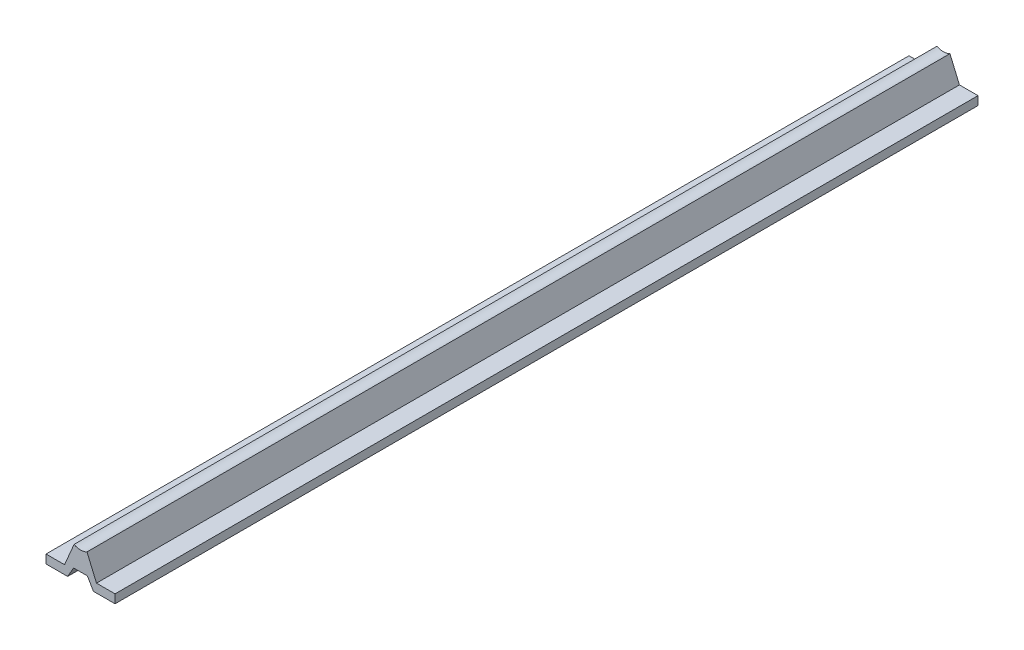
ISO-10303-21;
HEADER;
FILE_DESCRIPTION(('STEP AP214'),'2;1');
FILE_NAME('part.step','',(''),(''),'','','');
FILE_SCHEMA(('AUTOMOTIVE_DESIGN { 1 0 10303 214 1 1 1 1 }'));
ENDSEC;
DATA;
#1=APPLICATION_CONTEXT('core data for automotive mechanical design processes');
#2=APPLICATION_PROTOCOL_DEFINITION('international standard','automotive_design',2000,#1);
#3=PRODUCT_CONTEXT('',#1,'mechanical');
#4=PRODUCT('Part','Part','',(#3));
#5=PRODUCT_RELATED_PRODUCT_CATEGORY('part','',(#4));
#6=PRODUCT_DEFINITION_FORMATION('','',#4);
#7=PRODUCT_DEFINITION_CONTEXT('part definition',#1,'design');
#8=PRODUCT_DEFINITION('design','',#6,#7);
#9=PRODUCT_DEFINITION_SHAPE('','',#8);
#10=(LENGTH_UNIT() NAMED_UNIT(*) SI_UNIT(.MILLI.,.METRE.));
#11=(NAMED_UNIT(*) PLANE_ANGLE_UNIT() SI_UNIT($,.RADIAN.));
#12=(NAMED_UNIT(*) SI_UNIT($,.STERADIAN.) SOLID_ANGLE_UNIT());
#13=UNCERTAINTY_MEASURE_WITH_UNIT(LENGTH_MEASURE(1.E-05),#10,'distance_accuracy_value','');
#14=(GEOMETRIC_REPRESENTATION_CONTEXT(3) GLOBAL_UNCERTAINTY_ASSIGNED_CONTEXT((#13)) GLOBAL_UNIT_ASSIGNED_CONTEXT((#10,
#11,#12)) REPRESENTATION_CONTEXT('',''));
#15=CARTESIAN_POINT('',(0.,0.,0.));
#16=DIRECTION('',(0.,0.,1.));
#17=DIRECTION('',(1.,0.,0.));
#18=AXIS2_PLACEMENT_3D('',#15,#16,#17);
#19=CARTESIAN_POINT('',(-20.,-25.,500.));
#20=DIRECTION('',(1.,0.,0.));
#21=DIRECTION('',(0.,0.,-1.));
#22=AXIS2_PLACEMENT_3D('',#19,#20,#21);
#23=PLANE('',#22);
#24=DIRECTION('',(0.,-1.,0.));
#25=VECTOR('',#24,1.);
#26=CARTESIAN_POINT('',(-20.,-25.,0.));
#27=LINE('',#26,#25);
#28=CARTESIAN_POINT('',(-20.,-20.,0.));
#29=VERTEX_POINT('',#28);
#30=CARTESIAN_POINT('',(-20.,-25.,0.));
#31=VERTEX_POINT('',#30);
#32=EDGE_CURVE('E153',#29,#31,#27,.T.);
#33=ORIENTED_EDGE('',*,*,#32,.T.);
#34=DIRECTION('',(0.,0.,-1.));
#35=VECTOR('',#34,1.);
#36=CARTESIAN_POINT('',(-20.,-25.,500.));
#37=LINE('',#36,#35);
#38=CARTESIAN_POINT('',(-20.,-25.,500.));
#39=VERTEX_POINT('',#38);
#40=EDGE_CURVE('E11',#39,#31,#37,.T.);
#41=ORIENTED_EDGE('',*,*,#40,.F.);
#42=DIRECTION('',(0.,-1.,0.));
#43=VECTOR('',#42,1.);
#44=CARTESIAN_POINT('',(-20.,-25.,500.));
#45=LINE('',#44,#43);
#46=CARTESIAN_POINT('',(-20.,-20.,500.));
#47=VERTEX_POINT('',#46);
#48=EDGE_CURVE('E175',#47,#39,#45,.T.);
#49=ORIENTED_EDGE('',*,*,#48,.F.);
#50=DIRECTION('',(0.,0.,-1.));
#51=VECTOR('',#50,1.);
#52=CARTESIAN_POINT('',(-20.,-20.,500.));
#53=LINE('',#52,#51);
#54=EDGE_CURVE('E149',#47,#29,#53,.T.);
#55=ORIENTED_EDGE('',*,*,#54,.T.);
#56=EDGE_LOOP('',(#33,#41,#49,#55));
#57=FACE_BOUND('',#56,.T.);
#58=ADVANCED_FACE('F33',(#57),#23,.F.);
#59=CARTESIAN_POINT('',(-20.,-25.,500.));
#60=DIRECTION('',(0.,1.,0.));
#61=DIRECTION('',(0.,0.,1.));
#62=AXIS2_PLACEMENT_3D('',#59,#60,#61);
#63=PLANE('',#62);
#64=DIRECTION('',(1.,0.,0.));
#65=VECTOR('',#64,1.);
#66=CARTESIAN_POINT('',(-20.,-25.,0.));
#67=LINE('',#66,#65);
#68=CARTESIAN_POINT('',(-7.46410161513775,-25.,0.));
#69=VERTEX_POINT('',#68);
#70=EDGE_CURVE('E156',#31,#69,#67,.T.);
#71=ORIENTED_EDGE('',*,*,#70,.T.);
#72=DIRECTION('',(0.,0.,-1.));
#73=VECTOR('',#72,1.);
#74=CARTESIAN_POINT('',(-7.46410161513775,-25.,500.));
#75=LINE('',#74,#73);
#76=CARTESIAN_POINT('',(-7.46410161513775,-25.,500.));
#77=VERTEX_POINT('',#76);
#78=EDGE_CURVE('E41',#77,#69,#75,.T.);
#79=ORIENTED_EDGE('',*,*,#78,.F.);
#80=DIRECTION('',(1.,0.,0.));
#81=VECTOR('',#80,1.);
#82=CARTESIAN_POINT('',(-20.,-25.,500.));
#83=LINE('',#82,#81);
#84=EDGE_CURVE('E104',#39,#77,#83,.T.);
#85=ORIENTED_EDGE('',*,*,#84,.F.);
#86=ORIENTED_EDGE('',*,*,#40,.T.);
#87=EDGE_LOOP('',(#71,#79,#85,#86));
#88=FACE_BOUND('',#87,.T.);
#89=ADVANCED_FACE('F253',(#88),#63,.F.);
#90=CARTESIAN_POINT('',(-7.46410161513775,-25.,500.));
#91=DIRECTION('',(-0.866025403784439,0.5,0.));
#92=DIRECTION('',(-0.5,-0.866025403784439,0.));
#93=AXIS2_PLACEMENT_3D('',#90,#91,#92);
#94=PLANE('',#93);
#95=DIRECTION('',(0.5,0.866025403784439,0.));
#96=VECTOR('',#95,1.);
#97=CARTESIAN_POINT('',(-7.46410161513775,-25.,0.));
#98=LINE('',#97,#96);
#99=CARTESIAN_POINT('',(-4.,-19.,0.));
#100=VERTEX_POINT('',#99);
#101=EDGE_CURVE('E158',#69,#100,#98,.T.);
#102=ORIENTED_EDGE('',*,*,#101,.T.);
#103=DIRECTION('',(0.,0.,-1.));
#104=VECTOR('',#103,1.);
#105=CARTESIAN_POINT('',(-4.,-19.,500.));
#106=LINE('',#105,#104);
#107=CARTESIAN_POINT('',(-4.,-19.,500.));
#108=VERTEX_POINT('',#107);
#109=EDGE_CURVE('E194',#108,#100,#106,.T.);
#110=ORIENTED_EDGE('',*,*,#109,.F.);
#111=DIRECTION('',(0.5,0.866025403784439,0.));
#112=VECTOR('',#111,1.);
#113=CARTESIAN_POINT('',(-7.46410161513775,-25.,500.));
#114=LINE('',#113,#112);
#115=EDGE_CURVE('E202',#77,#108,#114,.T.);
#116=ORIENTED_EDGE('',*,*,#115,.F.);
#117=ORIENTED_EDGE('',*,*,#78,.T.);
#118=EDGE_LOOP('',(#102,#110,#116,#117));
#119=FACE_BOUND('',#118,.T.);
#120=ADVANCED_FACE('F200',(#119),#94,.F.);
#121=CARTESIAN_POINT('',(-4.,-19.,500.));
#122=DIRECTION('',(0.,1.,0.));
#123=DIRECTION('',(0.,0.,1.));
#124=AXIS2_PLACEMENT_3D('',#121,#122,#123);
#125=PLANE('',#124);
#126=DIRECTION('',(1.,0.,0.));
#127=VECTOR('',#126,1.);
#128=CARTESIAN_POINT('',(-4.,-19.,0.));
#129=LINE('',#128,#127);
#130=CARTESIAN_POINT('',(4.,-19.,0.));
#131=VERTEX_POINT('',#130);
#132=EDGE_CURVE('E160',#100,#131,#129,.T.);
#133=ORIENTED_EDGE('',*,*,#132,.T.);
#134=DIRECTION('',(0.,0.,-1.));
#135=VECTOR('',#134,1.);
#136=CARTESIAN_POINT('',(4.,-19.,500.));
#137=LINE('',#136,#135);
#138=CARTESIAN_POINT('',(4.,-19.,500.));
#139=VERTEX_POINT('',#138);
#140=EDGE_CURVE('E191',#139,#131,#137,.T.);
#141=ORIENTED_EDGE('',*,*,#140,.F.);
#142=DIRECTION('',(1.,0.,0.));
#143=VECTOR('',#142,1.);
#144=CARTESIAN_POINT('',(-4.,-19.,500.));
#145=LINE('',#144,#143);
#146=EDGE_CURVE('E220',#108,#139,#145,.T.);
#147=ORIENTED_EDGE('',*,*,#146,.F.);
#148=ORIENTED_EDGE('',*,*,#109,.T.);
#149=EDGE_LOOP('',(#133,#141,#147,#148));
#150=FACE_BOUND('',#149,.T.);
#151=ADVANCED_FACE('F211',(#150),#125,.F.);
#152=CARTESIAN_POINT('',(4.,-19.,500.));
#153=DIRECTION('',(0.866025403784439,0.499999999999999,0.));
#154=DIRECTION('',(-0.499999999999999,0.866025403784439,0.));
#155=AXIS2_PLACEMENT_3D('',#152,#153,#154);
#156=PLANE('',#155);
#157=DIRECTION('',(0.499999999999999,-0.866025403784439,0.));
#158=VECTOR('',#157,1.);
#159=CARTESIAN_POINT('',(4.,-19.,0.));
#160=LINE('',#159,#158);
#161=CARTESIAN_POINT('',(7.46410161513775,-25.,0.));
#162=VERTEX_POINT('',#161);
#163=EDGE_CURVE('E162',#131,#162,#160,.T.);
#164=ORIENTED_EDGE('',*,*,#163,.T.);
#165=DIRECTION('',(0.,0.,-1.));
#166=VECTOR('',#165,1.);
#167=CARTESIAN_POINT('',(7.46410161513775,-25.,500.));
#168=LINE('',#167,#166);
#169=CARTESIAN_POINT('',(7.46410161513775,-25.,500.));
#170=VERTEX_POINT('',#169);
#171=EDGE_CURVE('E188',#170,#162,#168,.T.);
#172=ORIENTED_EDGE('',*,*,#171,.F.);
#173=DIRECTION('',(0.499999999999999,-0.866025403784439,0.));
#174=VECTOR('',#173,1.);
#175=CARTESIAN_POINT('',(4.,-19.,500.));
#176=LINE('',#175,#174);
#177=EDGE_CURVE('E217',#139,#170,#176,.T.);
#178=ORIENTED_EDGE('',*,*,#177,.F.);
#179=ORIENTED_EDGE('',*,*,#140,.T.);
#180=EDGE_LOOP('',(#164,#172,#178,#179));
#181=FACE_BOUND('',#180,.T.);
#182=ADVANCED_FACE('F215',(#181),#156,.F.);
#183=CARTESIAN_POINT('',(7.46410161513775,-25.,500.));
#184=DIRECTION('',(0.,1.,0.));
#185=DIRECTION('',(-1.,0.,0.));
#186=AXIS2_PLACEMENT_3D('',#183,#184,#185);
#187=PLANE('',#186);
#188=DIRECTION('',(1.,0.,0.));
#189=VECTOR('',#188,1.);
#190=CARTESIAN_POINT('',(7.46410161513775,-25.,0.));
#191=LINE('',#190,#189);
#192=CARTESIAN_POINT('',(20.,-25.,0.));
#193=VERTEX_POINT('',#192);
#194=EDGE_CURVE('E164',#162,#193,#191,.T.);
#195=ORIENTED_EDGE('',*,*,#194,.T.);
#196=DIRECTION('',(0.,0.,-1.));
#197=VECTOR('',#196,1.);
#198=CARTESIAN_POINT('',(20.,-25.,500.));
#199=LINE('',#198,#197);
#200=CARTESIAN_POINT('',(20.,-25.,500.));
#201=VERTEX_POINT('',#200);
#202=EDGE_CURVE('E185',#201,#193,#199,.T.);
#203=ORIENTED_EDGE('',*,*,#202,.F.);
#204=DIRECTION('',(1.,0.,0.));
#205=VECTOR('',#204,1.);
#206=CARTESIAN_POINT('',(7.46410161513775,-25.,500.));
#207=LINE('',#206,#205);
#208=EDGE_CURVE('E219',#170,#201,#207,.T.);
#209=ORIENTED_EDGE('',*,*,#208,.F.);
#210=ORIENTED_EDGE('',*,*,#171,.T.);
#211=EDGE_LOOP('',(#195,#203,#209,#210));
#212=FACE_BOUND('',#211,.T.);
#213=ADVANCED_FACE('F266',(#212),#187,.F.);
#214=CARTESIAN_POINT('',(20.,-25.,500.));
#215=DIRECTION('',(-1.,0.,0.));
#216=DIRECTION('',(0.,0.,1.));
#217=AXIS2_PLACEMENT_3D('',#214,#215,#216);
#218=PLANE('',#217);
#219=DIRECTION('',(0.,1.,0.));
#220=VECTOR('',#219,1.);
#221=CARTESIAN_POINT('',(20.,-25.,0.));
#222=LINE('',#221,#220);
#223=CARTESIAN_POINT('',(20.,-20.,0.));
#224=VERTEX_POINT('',#223);
#225=EDGE_CURVE('E166',#193,#224,#222,.T.);
#226=ORIENTED_EDGE('',*,*,#225,.T.);
#227=DIRECTION('',(0.,0.,-1.));
#228=VECTOR('',#227,1.);
#229=CARTESIAN_POINT('',(20.,-20.,500.));
#230=LINE('',#229,#228);
#231=CARTESIAN_POINT('',(20.,-20.,500.));
#232=VERTEX_POINT('',#231);
#233=EDGE_CURVE('E182',#232,#224,#230,.T.);
#234=ORIENTED_EDGE('',*,*,#233,.F.);
#235=DIRECTION('',(0.,1.,0.));
#236=VECTOR('',#235,1.);
#237=CARTESIAN_POINT('',(20.,-25.,500.));
#238=LINE('',#237,#236);
#239=EDGE_CURVE('E222',#201,#232,#238,.T.);
#240=ORIENTED_EDGE('',*,*,#239,.F.);
#241=ORIENTED_EDGE('',*,*,#202,.T.);
#242=EDGE_LOOP('',(#226,#234,#240,#241));
#243=FACE_BOUND('',#242,.T.);
#244=ADVANCED_FACE('F269',(#243),#218,.F.);
#245=CARTESIAN_POINT('',(20.,-20.,500.));
#246=DIRECTION('',(0.,-1.,0.));
#247=DIRECTION('',(0.,0.,-1.));
#248=AXIS2_PLACEMENT_3D('',#245,#246,#247);
#249=PLANE('',#248);
#250=DIRECTION('',(-1.,0.,0.));
#251=VECTOR('',#250,1.);
#252=CARTESIAN_POINT('',(20.,-20.,0.));
#253=LINE('',#252,#251);
#254=CARTESIAN_POINT('',(9.25,-20.,0.));
#255=VERTEX_POINT('',#254);
#256=EDGE_CURVE('E168',#224,#255,#253,.T.);
#257=ORIENTED_EDGE('',*,*,#256,.T.);
#258=DIRECTION('',(0.,0.,-1.));
#259=VECTOR('',#258,1.);
#260=CARTESIAN_POINT('',(9.25,-20.,500.));
#261=LINE('',#260,#259);
#262=CARTESIAN_POINT('',(9.25,-20.,500.));
#263=VERTEX_POINT('',#262);
#264=EDGE_CURVE('E179',#263,#255,#261,.T.);
#265=ORIENTED_EDGE('',*,*,#264,.F.);
#266=DIRECTION('',(-1.,0.,0.));
#267=VECTOR('',#266,1.);
#268=CARTESIAN_POINT('',(20.,-20.,500.));
#269=LINE('',#268,#267);
#270=EDGE_CURVE('E228',#232,#263,#269,.T.);
#271=ORIENTED_EDGE('',*,*,#270,.F.);
#272=ORIENTED_EDGE('',*,*,#233,.T.);
#273=EDGE_LOOP('',(#257,#265,#271,#272));
#274=FACE_BOUND('',#273,.T.);
#275=ADVANCED_FACE('F234',(#274),#249,.F.);
#276=CARTESIAN_POINT('',(3.75,-7.06664701255129,500.));
#277=DIRECTION('',(-0.920245732120231,-0.391341018185547,0.));
#278=DIRECTION('',(0.391341018185547,-0.920245732120231,0.));
#279=AXIS2_PLACEMENT_3D('',#276,#277,#278);
#280=PLANE('',#279);
#281=DIRECTION('',(-0.391341018185547,0.920245732120231,0.));
#282=VECTOR('',#281,1.);
#283=CARTESIAN_POINT('',(3.75,-7.06664701255129,0.));
#284=LINE('',#283,#282);
#285=CARTESIAN_POINT('',(3.75,-7.06664701255129,0.));
#286=VERTEX_POINT('',#285);
#287=EDGE_CURVE('E170',#255,#286,#284,.T.);
#288=ORIENTED_EDGE('',*,*,#287,.T.);
#289=DIRECTION('',(0.,0.,-1.));
#290=VECTOR('',#289,1.);
#291=CARTESIAN_POINT('',(3.75,-7.06664701255129,500.));
#292=LINE('',#291,#290);
#293=CARTESIAN_POINT('',(3.75,-7.06664701255129,500.));
#294=VERTEX_POINT('',#293);
#295=EDGE_CURVE('E144',#294,#286,#292,.T.);
#296=ORIENTED_EDGE('',*,*,#295,.F.);
#297=DIRECTION('',(-0.391341018185547,0.920245732120231,0.));
#298=VECTOR('',#297,1.);
#299=CARTESIAN_POINT('',(3.75,-7.06664701255129,500.));
#300=LINE('',#299,#298);
#301=EDGE_CURVE('E135',#263,#294,#300,.T.);
#302=ORIENTED_EDGE('',*,*,#301,.F.);
#303=ORIENTED_EDGE('',*,*,#264,.T.);
#304=EDGE_LOOP('',(#288,#296,#302,#303));
#305=FACE_BOUND('',#304,.T.);
#306=ADVANCED_FACE('F238',(#305),#280,.F.);
#307=CARTESIAN_POINT('',(0.,0.,500.));
#308=DIRECTION('',(0.,0.,-1.));
#309=DIRECTION('',(-1.,0.,0.));
#310=AXIS2_PLACEMENT_3D('',#307,#308,#309);
#311=CYLINDRICAL_SURFACE('',#310,8.);
#312=CARTESIAN_POINT('',(0.,0.,0.));
#313=DIRECTION('',(0.,0.,-1.));
#314=DIRECTION('',(1.,0.,0.));
#315=AXIS2_PLACEMENT_3D('',#312,#313,#314);
#316=CIRCLE('',#315,8.);
#317=CARTESIAN_POINT('',(-3.75000000000001,-7.06664701255128,0.));
#318=VERTEX_POINT('',#317);
#319=EDGE_CURVE('E143',#286,#318,#316,.T.);
#320=ORIENTED_EDGE('',*,*,#319,.T.);
#321=DIRECTION('',(0.,0.,-1.));
#322=VECTOR('',#321,1.);
#323=CARTESIAN_POINT('',(-3.75000000000001,-7.06664701255128,500.));
#324=LINE('',#323,#322);
#325=CARTESIAN_POINT('',(-3.75000000000001,-7.06664701255128,500.));
#326=VERTEX_POINT('',#325);
#327=EDGE_CURVE('E140',#326,#318,#324,.T.);
#328=ORIENTED_EDGE('',*,*,#327,.F.);
#329=CARTESIAN_POINT('',(0.,0.,500.));
#330=DIRECTION('',(0.,0.,-1.));
#331=DIRECTION('',(1.,0.,0.));
#332=AXIS2_PLACEMENT_3D('',#329,#330,#331);
#333=CIRCLE('',#332,8.);
#334=EDGE_CURVE('E129',#294,#326,#333,.T.);
#335=ORIENTED_EDGE('',*,*,#334,.F.);
#336=ORIENTED_EDGE('',*,*,#295,.T.);
#337=EDGE_LOOP('',(#320,#328,#335,#336));
#338=FACE_BOUND('',#337,.T.);
#339=ADVANCED_FACE('F141',(#338),#311,.F.);
#340=CARTESIAN_POINT('',(-9.25,-20.,500.));
#341=DIRECTION('',(0.920245732120231,-0.391341018185547,0.));
#342=DIRECTION('',(0.391341018185547,0.920245732120231,0.));
#343=AXIS2_PLACEMENT_3D('',#340,#341,#342);
#344=PLANE('',#343);
#345=DIRECTION('',(-0.391341018185547,-0.920245732120231,0.));
#346=VECTOR('',#345,1.);
#347=CARTESIAN_POINT('',(-9.25,-20.,0.));
#348=LINE('',#347,#346);
#349=CARTESIAN_POINT('',(-9.25,-20.,0.));
#350=VERTEX_POINT('',#349);
#351=EDGE_CURVE('E90',#318,#350,#348,.T.);
#352=ORIENTED_EDGE('',*,*,#351,.T.);
#353=DIRECTION('',(0.,0.,-1.));
#354=VECTOR('',#353,1.);
#355=CARTESIAN_POINT('',(-9.25,-20.,500.));
#356=LINE('',#355,#354);
#357=CARTESIAN_POINT('',(-9.25,-20.,500.));
#358=VERTEX_POINT('',#357);
#359=EDGE_CURVE('E145',#358,#350,#356,.T.);
#360=ORIENTED_EDGE('',*,*,#359,.F.);
#361=DIRECTION('',(-0.391341018185547,-0.920245732120231,0.));
#362=VECTOR('',#361,1.);
#363=CARTESIAN_POINT('',(-9.25,-20.,500.));
#364=LINE('',#363,#362);
#365=EDGE_CURVE('E133',#326,#358,#364,.T.);
#366=ORIENTED_EDGE('',*,*,#365,.F.);
#367=ORIENTED_EDGE('',*,*,#327,.T.);
#368=EDGE_LOOP('',(#352,#360,#366,#367));
#369=FACE_BOUND('',#368,.T.);
#370=ADVANCED_FACE('F147',(#369),#344,.F.);
#371=CARTESIAN_POINT('',(-20.,-20.,500.));
#372=DIRECTION('',(0.,-1.,0.));
#373=DIRECTION('',(1.,0.,0.));
#374=AXIS2_PLACEMENT_3D('',#371,#372,#373);
#375=PLANE('',#374);
#376=DIRECTION('',(-1.,0.,0.));
#377=VECTOR('',#376,1.);
#378=CARTESIAN_POINT('',(-20.,-20.,0.));
#379=LINE('',#378,#377);
#380=EDGE_CURVE('E96',#350,#29,#379,.T.);
#381=ORIENTED_EDGE('',*,*,#380,.T.);
#382=ORIENTED_EDGE('',*,*,#54,.F.);
#383=DIRECTION('',(-1.,0.,0.));
#384=VECTOR('',#383,1.);
#385=CARTESIAN_POINT('',(-20.,-20.,500.));
#386=LINE('',#385,#384);
#387=EDGE_CURVE('E49',#358,#47,#386,.T.);
#388=ORIENTED_EDGE('',*,*,#387,.F.);
#389=ORIENTED_EDGE('',*,*,#359,.T.);
#390=EDGE_LOOP('',(#381,#382,#388,#389));
#391=FACE_BOUND('',#390,.T.);
#392=ADVANCED_FACE('F242',(#391),#375,.F.);
#393=CARTESIAN_POINT('',(0.,0.,500.));
#394=DIRECTION('',(0.,0.,1.));
#395=DIRECTION('',(1.,0.,0.));
#396=AXIS2_PLACEMENT_3D('',#393,#394,#395);
#397=PLANE('',#396);
#398=ORIENTED_EDGE('',*,*,#48,.T.);
#399=ORIENTED_EDGE('',*,*,#84,.T.);
#400=ORIENTED_EDGE('',*,*,#115,.T.);
#401=ORIENTED_EDGE('',*,*,#146,.T.);
#402=ORIENTED_EDGE('',*,*,#177,.T.);
#403=ORIENTED_EDGE('',*,*,#208,.T.);
#404=ORIENTED_EDGE('',*,*,#239,.T.);
#405=ORIENTED_EDGE('',*,*,#270,.T.);
#406=ORIENTED_EDGE('',*,*,#301,.T.);
#407=ORIENTED_EDGE('',*,*,#334,.T.);
#408=ORIENTED_EDGE('',*,*,#365,.T.);
#409=ORIENTED_EDGE('',*,*,#387,.T.);
#410=EDGE_LOOP('',(#398,#399,#400,#401,#402,#403,#404,#405,#406,#407,#408,#409));
#411=FACE_BOUND('',#410,.T.);
#412=ADVANCED_FACE('F131',(#411),#397,.T.);
#413=CARTESIAN_POINT('',(0.,0.,0.));
#414=DIRECTION('',(0.,0.,1.));
#415=DIRECTION('',(1.,0.,0.));
#416=AXIS2_PLACEMENT_3D('',#413,#414,#415);
#417=PLANE('',#416);
#418=ORIENTED_EDGE('',*,*,#32,.F.);
#419=ORIENTED_EDGE('',*,*,#380,.F.);
#420=ORIENTED_EDGE('',*,*,#351,.F.);
#421=ORIENTED_EDGE('',*,*,#319,.F.);
#422=ORIENTED_EDGE('',*,*,#287,.F.);
#423=ORIENTED_EDGE('',*,*,#256,.F.);
#424=ORIENTED_EDGE('',*,*,#225,.F.);
#425=ORIENTED_EDGE('',*,*,#194,.F.);
#426=ORIENTED_EDGE('',*,*,#163,.F.);
#427=ORIENTED_EDGE('',*,*,#132,.F.);
#428=ORIENTED_EDGE('',*,*,#101,.F.);
#429=ORIENTED_EDGE('',*,*,#70,.F.);
#430=EDGE_LOOP('',(#418,#419,#420,#421,#422,#423,#424,#425,#426,#427,#428,#429));
#431=FACE_BOUND('',#430,.T.);
#432=ADVANCED_FACE('F206',(#431),#417,.F.);
#433=CLOSED_SHELL('',(#58,#89,#120,#151,#182,#213,#244,#275,#306,#339,#370,#392,#412,#432));
#434=MANIFOLD_SOLID_BREP('B2',#433);
#435=ADVANCED_BREP_SHAPE_REPRESENTATION('',(#18,#434),#14);
#436=SHAPE_DEFINITION_REPRESENTATION(#9,#435);
ENDSEC;
END-ISO-10303-21;
